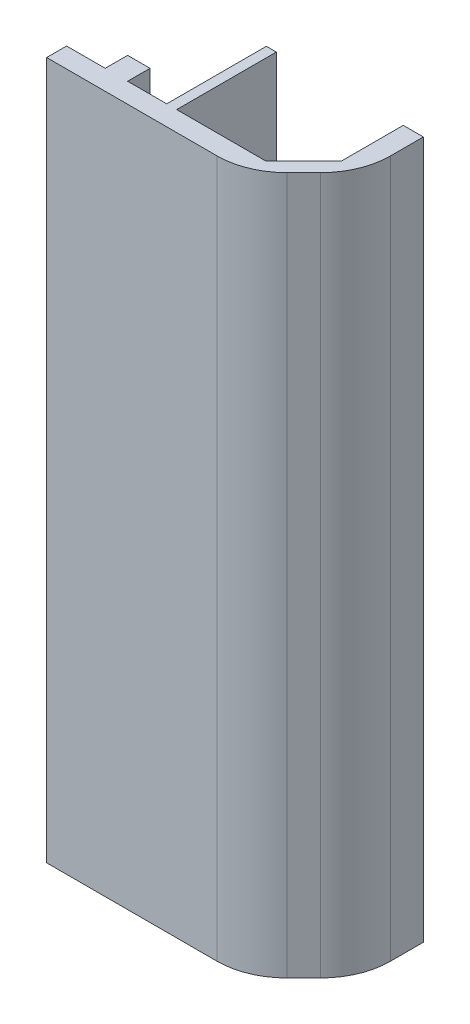
ISO-10303-21;
HEADER;
FILE_DESCRIPTION(('STEP AP214'),'2;1');
FILE_NAME('part.step','',(''),(''),'','','');
FILE_SCHEMA(('AUTOMOTIVE_DESIGN { 1 0 10303 214 1 1 1 1 }'));
ENDSEC;
DATA;
#1=APPLICATION_CONTEXT('core data for automotive mechanical design processes');
#2=APPLICATION_PROTOCOL_DEFINITION('international standard','automotive_design',2000,#1);
#3=PRODUCT_CONTEXT('',#1,'mechanical');
#4=PRODUCT('Part','Part','',(#3));
#5=PRODUCT_RELATED_PRODUCT_CATEGORY('part','',(#4));
#6=PRODUCT_DEFINITION_FORMATION('','',#4);
#7=PRODUCT_DEFINITION_CONTEXT('part definition',#1,'design');
#8=PRODUCT_DEFINITION('design','',#6,#7);
#9=PRODUCT_DEFINITION_SHAPE('','',#8);
#10=(LENGTH_UNIT() NAMED_UNIT(*) SI_UNIT(.MILLI.,.METRE.));
#11=(NAMED_UNIT(*) PLANE_ANGLE_UNIT() SI_UNIT($,.RADIAN.));
#12=(NAMED_UNIT(*) SI_UNIT($,.STERADIAN.) SOLID_ANGLE_UNIT());
#13=UNCERTAINTY_MEASURE_WITH_UNIT(LENGTH_MEASURE(1.E-05),#10,'distance_accuracy_value','');
#14=(GEOMETRIC_REPRESENTATION_CONTEXT(3) GLOBAL_UNCERTAINTY_ASSIGNED_CONTEXT((#13)) GLOBAL_UNIT_ASSIGNED_CONTEXT((#10,
#11,#12)) REPRESENTATION_CONTEXT('',''));
#15=CARTESIAN_POINT('',(0.,0.,0.));
#16=DIRECTION('',(0.,0.,1.));
#17=DIRECTION('',(1.,0.,0.));
#18=AXIS2_PLACEMENT_3D('',#15,#16,#17);
#19=CARTESIAN_POINT('',(-23.0017231924407,140.,-2.35925925925926));
#20=DIRECTION('',(0.,0.,1.));
#21=DIRECTION('',(1.,0.,0.));
#22=AXIS2_PLACEMENT_3D('',#19,#20,#21);
#23=PLANE('',#22);
#24=DIRECTION('',(0.,-1.,0.));
#25=VECTOR('',#24,1.);
#26=CARTESIAN_POINT('',(-13.1517231924407,140.,-2.35925925925926));
#27=LINE('',#26,#25);
#28=CARTESIAN_POINT('',(-13.1517231924407,140.,-2.35925925925926));
#29=VERTEX_POINT('',#28);
#30=CARTESIAN_POINT('',(-13.1517231924407,0.,-2.35925925925926));
#31=VERTEX_POINT('',#30);
#32=EDGE_CURVE('E59',#29,#31,#27,.T.);
#33=ORIENTED_EDGE('',*,*,#32,.F.);
#34=DIRECTION('',(-1.,0.,0.));
#35=VECTOR('',#34,1.);
#36=CARTESIAN_POINT('',(-23.0017231924407,140.,-2.35925925925926));
#37=LINE('',#36,#35);
#38=CARTESIAN_POINT('',(4.74827680755932,140.,-2.35925925925926));
#39=VERTEX_POINT('',#38);
#40=EDGE_CURVE('E218',#39,#29,#37,.T.);
#41=ORIENTED_EDGE('',*,*,#40,.F.);
#42=DIRECTION('',(0.,-1.,0.));
#43=VECTOR('',#42,1.);
#44=CARTESIAN_POINT('',(4.74827680755932,140.,-2.35925925925926));
#45=LINE('',#44,#43);
#46=CARTESIAN_POINT('',(4.74827680755932,0.,-2.35925925925926));
#47=VERTEX_POINT('',#46);
#48=EDGE_CURVE('E256',#39,#47,#45,.T.);
#49=ORIENTED_EDGE('',*,*,#48,.T.);
#50=DIRECTION('',(-1.,0.,0.));
#51=VECTOR('',#50,1.);
#52=CARTESIAN_POINT('',(-23.0017231924407,0.,-2.35925925925926));
#53=LINE('',#52,#51);
#54=EDGE_CURVE('E243',#47,#31,#53,.T.);
#55=ORIENTED_EDGE('',*,*,#54,.T.);
#56=EDGE_LOOP('',(#33,#41,#49,#55));
#57=FACE_BOUND('',#56,.T.);
#58=ADVANCED_FACE('F36',(#57),#23,.F.);
#59=DIRECTION('',(0.,1.,0.));
#60=VECTOR('',#59,1.);
#61=CARTESIAN_POINT('',(-15.1517231924407,140.,-2.35925925925926));
#62=LINE('',#61,#60);
#63=CARTESIAN_POINT('',(-15.1517231924407,0.,-2.35925925925926));
#64=VERTEX_POINT('',#63);
#65=CARTESIAN_POINT('',(-15.1517231924407,140.,-2.35925925925926));
#66=VERTEX_POINT('',#65);
#67=EDGE_CURVE('E184',#64,#66,#62,.T.);
#68=ORIENTED_EDGE('',*,*,#67,.F.);
#69=CARTESIAN_POINT('',(-23.0017231924407,0.,-2.35925925925926));
#70=VERTEX_POINT('',#69);
#71=EDGE_CURVE('E242',#64,#70,#53,.T.);
#72=ORIENTED_EDGE('',*,*,#71,.T.);
#73=DIRECTION('',(0.,-1.,0.));
#74=VECTOR('',#73,1.);
#75=CARTESIAN_POINT('',(-23.0017231924407,140.,-2.35925925925926));
#76=LINE('',#75,#74);
#77=CARTESIAN_POINT('',(-23.0017231924407,140.,-2.35925925925926));
#78=VERTEX_POINT('',#77);
#79=EDGE_CURVE('E253',#78,#70,#76,.T.);
#80=ORIENTED_EDGE('',*,*,#79,.F.);
#81=EDGE_CURVE('E51',#66,#78,#37,.T.);
#82=ORIENTED_EDGE('',*,*,#81,.F.);
#83=EDGE_LOOP('',(#68,#72,#80,#82));
#84=FACE_BOUND('',#83,.T.);
#85=ADVANCED_FACE('F328',(#84),#23,.F.);
#86=CARTESIAN_POINT('',(-27.5017231924407,140.,-6.85925925925926));
#87=DIRECTION('',(1.,0.,0.));
#88=DIRECTION('',(0.,0.,-1.));
#89=AXIS2_PLACEMENT_3D('',#86,#87,#88);
#90=PLANE('',#89);
#91=DIRECTION('',(0.,0.,1.));
#92=VECTOR('',#91,1.);
#93=CARTESIAN_POINT('',(-27.5017231924407,0.,-6.85925925925926));
#94=LINE('',#93,#92);
#95=CARTESIAN_POINT('',(-27.5017231924407,0.,-6.85925925925926));
#96=VERTEX_POINT('',#95);
#97=CARTESIAN_POINT('',(-27.5017231924407,0.,-2.35925925925926));
#98=VERTEX_POINT('',#97);
#99=EDGE_CURVE('E187',#96,#98,#94,.T.);
#100=ORIENTED_EDGE('',*,*,#99,.T.);
#101=DIRECTION('',(0.,-1.,0.));
#102=VECTOR('',#101,1.);
#103=CARTESIAN_POINT('',(-27.5017231924407,140.,-2.35925925925926));
#104=LINE('',#103,#102);
#105=CARTESIAN_POINT('',(-27.5017231924407,140.,-2.35925925925926));
#106=VERTEX_POINT('',#105);
#107=EDGE_CURVE('E274',#106,#98,#104,.T.);
#108=ORIENTED_EDGE('',*,*,#107,.F.);
#109=DIRECTION('',(0.,0.,1.));
#110=VECTOR('',#109,1.);
#111=CARTESIAN_POINT('',(-27.5017231924407,140.,-6.85925925925926));
#112=LINE('',#111,#110);
#113=CARTESIAN_POINT('',(-27.5017231924407,140.,-6.85925925925926));
#114=VERTEX_POINT('',#113);
#115=EDGE_CURVE('E196',#114,#106,#112,.T.);
#116=ORIENTED_EDGE('',*,*,#115,.F.);
#117=DIRECTION('',(0.,-1.,0.));
#118=VECTOR('',#117,1.);
#119=CARTESIAN_POINT('',(-27.5017231924407,140.,-6.85925925925926));
#120=LINE('',#119,#118);
#121=EDGE_CURVE('E223',#114,#96,#120,.T.);
#122=ORIENTED_EDGE('',*,*,#121,.T.);
#123=EDGE_LOOP('',(#100,#108,#116,#122));
#124=FACE_BOUND('',#123,.T.);
#125=ADVANCED_FACE('F318',(#124),#90,.F.);
#126=CARTESIAN_POINT('',(-27.5017231924407,140.,-2.35925925925926));
#127=DIRECTION('',(0.,0.,1.));
#128=DIRECTION('',(1.,0.,0.));
#129=AXIS2_PLACEMENT_3D('',#126,#127,#128);
#130=PLANE('',#129);
#131=DIRECTION('',(-1.,0.,0.));
#132=VECTOR('',#131,1.);
#133=CARTESIAN_POINT('',(-27.5017231924407,0.,-2.35925925925926));
#134=LINE('',#133,#132);
#135=CARTESIAN_POINT('',(-35.2517231924407,0.,-2.35925925925926));
#136=VERTEX_POINT('',#135);
#137=EDGE_CURVE('E190',#98,#136,#134,.T.);
#138=ORIENTED_EDGE('',*,*,#137,.T.);
#139=DIRECTION('',(0.,-1.,0.));
#140=VECTOR('',#139,1.);
#141=CARTESIAN_POINT('',(-35.2517231924407,140.,-2.35925925925926));
#142=LINE('',#141,#140);
#143=CARTESIAN_POINT('',(-35.2517231924407,140.,-2.35925925925926));
#144=VERTEX_POINT('',#143);
#145=EDGE_CURVE('E271',#144,#136,#142,.T.);
#146=ORIENTED_EDGE('',*,*,#145,.F.);
#147=DIRECTION('',(-1.,0.,0.));
#148=VECTOR('',#147,1.);
#149=CARTESIAN_POINT('',(-27.5017231924407,140.,-2.35925925925926));
#150=LINE('',#149,#148);
#151=EDGE_CURVE('E199',#106,#144,#150,.T.);
#152=ORIENTED_EDGE('',*,*,#151,.F.);
#153=ORIENTED_EDGE('',*,*,#107,.T.);
#154=EDGE_LOOP('',(#138,#146,#152,#153));
#155=FACE_BOUND('',#154,.T.);
#156=ADVANCED_FACE('F315',(#155),#130,.F.);
#157=CARTESIAN_POINT('',(-35.2517231924407,140.,-2.35925925925926));
#158=DIRECTION('',(1.,0.,0.));
#159=DIRECTION('',(0.,0.,-1.));
#160=AXIS2_PLACEMENT_3D('',#157,#158,#159);
#161=PLANE('',#160);
#162=DIRECTION('',(0.,0.,1.));
#163=VECTOR('',#162,1.);
#164=CARTESIAN_POINT('',(-35.2517231924407,0.,-2.35925925925926));
#165=LINE('',#164,#163);
#166=CARTESIAN_POINT('',(-35.2517231924407,0.,1.64074074074074));
#167=VERTEX_POINT('',#166);
#168=EDGE_CURVE('E226',#136,#167,#165,.T.);
#169=ORIENTED_EDGE('',*,*,#168,.T.);
#170=DIRECTION('',(0.,-1.,0.));
#171=VECTOR('',#170,1.);
#172=CARTESIAN_POINT('',(-35.2517231924407,140.,1.64074074074074));
#173=LINE('',#172,#171);
#174=CARTESIAN_POINT('',(-35.2517231924407,140.,1.64074074074074));
#175=VERTEX_POINT('',#174);
#176=EDGE_CURVE('E268',#175,#167,#173,.T.);
#177=ORIENTED_EDGE('',*,*,#176,.F.);
#178=DIRECTION('',(0.,0.,1.));
#179=VECTOR('',#178,1.);
#180=CARTESIAN_POINT('',(-35.2517231924407,140.,-2.35925925925926));
#181=LINE('',#180,#179);
#182=EDGE_CURVE('E202',#144,#175,#181,.T.);
#183=ORIENTED_EDGE('',*,*,#182,.F.);
#184=ORIENTED_EDGE('',*,*,#145,.T.);
#185=EDGE_LOOP('',(#169,#177,#183,#184));
#186=FACE_BOUND('',#185,.T.);
#187=ADVANCED_FACE('F309',(#186),#161,.F.);
#188=CARTESIAN_POINT('',(-35.2517231924407,140.,1.64074074074074));
#189=DIRECTION('',(0.,0.,-1.));
#190=DIRECTION('',(-1.,0.,0.));
#191=AXIS2_PLACEMENT_3D('',#188,#189,#190);
#192=PLANE('',#191);
#193=DIRECTION('',(1.,0.,0.));
#194=VECTOR('',#193,1.);
#195=CARTESIAN_POINT('',(-35.2517231924407,0.,1.64074074074074));
#196=LINE('',#195,#194);
#197=CARTESIAN_POINT('',(-1.02071306566402,0.,1.64074074074074));
#198=VERTEX_POINT('',#197);
#199=EDGE_CURVE('E228',#167,#198,#196,.T.);
#200=ORIENTED_EDGE('',*,*,#199,.T.);
#201=DIRECTION('',(0.,-1.,0.));
#202=VECTOR('',#201,1.);
#203=CARTESIAN_POINT('',(-1.02071306566402,140.,1.64074074074074));
#204=LINE('',#203,#202);
#205=CARTESIAN_POINT('',(-1.02071306566402,140.,1.64074074074074));
#206=VERTEX_POINT('',#205);
#207=EDGE_CURVE('E286',#198,#206,#204,.F.);
#208=ORIENTED_EDGE('',*,*,#207,.T.);
#209=DIRECTION('',(1.,0.,0.));
#210=VECTOR('',#209,1.);
#211=CARTESIAN_POINT('',(-35.2517231924407,140.,1.64074074074074));
#212=LINE('',#211,#210);
#213=EDGE_CURVE('E204',#175,#206,#212,.T.);
#214=ORIENTED_EDGE('',*,*,#213,.F.);
#215=ORIENTED_EDGE('',*,*,#176,.T.);
#216=EDGE_LOOP('',(#200,#208,#214,#215));
#217=FACE_BOUND('',#216,.T.);
#218=ADVANCED_FACE('F305',(#217),#192,.F.);
#219=CARTESIAN_POINT('',(4.77827680755932,140.,1.64074074074074));
#220=DIRECTION('',(-0.707106781186547,0.,-0.707106781186548));
#221=DIRECTION('',(-0.707106781186548,0.,0.707106781186547));
#222=AXIS2_PLACEMENT_3D('',#219,#220,#221);
#223=PLANE('',#222);
#224=DIRECTION('',(0.707106781186548,0.,-0.707106781186547));
#225=VECTOR('',#224,1.);
#226=CARTESIAN_POINT('',(4.77827680755932,140.,1.64074074074074));
#227=LINE('',#226,#225);
#228=CARTESIAN_POINT('',(8.87878187094765,140.,-2.45976432264759));
#229=VERTEX_POINT('',#228);
#230=CARTESIAN_POINT('',(12.2611050775043,140.,-5.84208752920423));
#231=VERTEX_POINT('',#230);
#232=EDGE_CURVE('E207',#229,#231,#227,.T.);
#233=ORIENTED_EDGE('',*,*,#232,.F.);
#234=DIRECTION('',(0.,-1.,0.));
#235=VECTOR('',#234,1.);
#236=CARTESIAN_POINT('',(8.87878187094765,140.,-2.45976432264759));
#237=LINE('',#236,#235);
#238=CARTESIAN_POINT('',(8.87878187094765,0.,-2.45976432264759));
#239=VERTEX_POINT('',#238);
#240=EDGE_CURVE('E279',#229,#239,#237,.T.);
#241=ORIENTED_EDGE('',*,*,#240,.T.);
#242=DIRECTION('',(0.707106781186548,0.,-0.707106781186547));
#243=VECTOR('',#242,1.);
#244=CARTESIAN_POINT('',(4.77827680755932,0.,1.64074074074074));
#245=LINE('',#244,#243);
#246=CARTESIAN_POINT('',(12.2611050775043,0.,-5.84208752920423));
#247=VERTEX_POINT('',#246);
#248=EDGE_CURVE('E231',#239,#247,#245,.T.);
#249=ORIENTED_EDGE('',*,*,#248,.T.);
#250=DIRECTION('',(0.,-1.,0.));
#251=VECTOR('',#250,1.);
#252=CARTESIAN_POINT('',(12.2611050775043,140.,-5.84208752920422));
#253=LINE('',#252,#251);
#254=EDGE_CURVE('E277',#247,#231,#253,.F.);
#255=ORIENTED_EDGE('',*,*,#254,.T.);
#256=EDGE_LOOP('',(#233,#241,#249,#255));
#257=FACE_BOUND('',#256,.T.);
#258=ADVANCED_FACE('F299',(#257),#223,.F.);
#259=CARTESIAN_POINT('',(16.3616101408926,140.,-22.3592592592593));
#260=DIRECTION('',(-1.,0.,0.));
#261=DIRECTION('',(0.,0.,1.));
#262=AXIS2_PLACEMENT_3D('',#259,#260,#261);
#263=PLANE('',#262);
#264=DIRECTION('',(0.,0.,-1.));
#265=VECTOR('',#264,1.);
#266=CARTESIAN_POINT('',(16.3616101408926,140.,-22.3592592592593));
#267=LINE('',#266,#265);
#268=CARTESIAN_POINT('',(16.3616101408926,140.,-15.7415824658159));
#269=VERTEX_POINT('',#268);
#270=CARTESIAN_POINT('',(16.3616101408926,140.,-22.3592592592593));
#271=VERTEX_POINT('',#270);
#272=EDGE_CURVE('E210',#269,#271,#267,.T.);
#273=ORIENTED_EDGE('',*,*,#272,.F.);
#274=DIRECTION('',(0.,-1.,0.));
#275=VECTOR('',#274,1.);
#276=CARTESIAN_POINT('',(16.3616101408926,140.,-15.7415824658159));
#277=LINE('',#276,#275);
#278=CARTESIAN_POINT('',(16.3616101408926,0.,-15.7415824658159));
#279=VERTEX_POINT('',#278);
#280=EDGE_CURVE('E11',#269,#279,#277,.T.);
#281=ORIENTED_EDGE('',*,*,#280,.T.);
#282=DIRECTION('',(0.,0.,-1.));
#283=VECTOR('',#282,1.);
#284=CARTESIAN_POINT('',(16.3616101408926,0.,-22.3592592592593));
#285=LINE('',#284,#283);
#286=CARTESIAN_POINT('',(16.3616101408926,0.,-22.3592592592593));
#287=VERTEX_POINT('',#286);
#288=EDGE_CURVE('E234',#279,#287,#285,.T.);
#289=ORIENTED_EDGE('',*,*,#288,.T.);
#290=DIRECTION('',(0.,-1.,0.));
#291=VECTOR('',#290,1.);
#292=CARTESIAN_POINT('',(16.3616101408926,140.,-22.3592592592593));
#293=LINE('',#292,#291);
#294=EDGE_CURVE('E265',#271,#287,#293,.T.);
#295=ORIENTED_EDGE('',*,*,#294,.F.);
#296=EDGE_LOOP('',(#273,#281,#289,#295));
#297=FACE_BOUND('',#296,.T.);
#298=ADVANCED_FACE('F358',(#297),#263,.F.);
#299=CARTESIAN_POINT('',(12.3316101408926,140.,-22.3592592592593));
#300=DIRECTION('',(0.,0.,1.));
#301=DIRECTION('',(1.,0.,0.));
#302=AXIS2_PLACEMENT_3D('',#299,#300,#301);
#303=PLANE('',#302);
#304=DIRECTION('',(-1.,0.,0.));
#305=VECTOR('',#304,1.);
#306=CARTESIAN_POINT('',(12.3316101408926,0.,-22.3592592592593));
#307=LINE('',#306,#305);
#308=CARTESIAN_POINT('',(12.3316101408926,0.,-22.3592592592593));
#309=VERTEX_POINT('',#308);
#310=EDGE_CURVE('E236',#287,#309,#307,.T.);
#311=ORIENTED_EDGE('',*,*,#310,.T.);
#312=DIRECTION('',(0.,-1.,0.));
#313=VECTOR('',#312,1.);
#314=CARTESIAN_POINT('',(12.3316101408926,140.,-22.3592592592593));
#315=LINE('',#314,#313);
#316=CARTESIAN_POINT('',(12.3316101408926,140.,-22.3592592592593));
#317=VERTEX_POINT('',#316);
#318=EDGE_CURVE('E262',#317,#309,#315,.T.);
#319=ORIENTED_EDGE('',*,*,#318,.F.);
#320=DIRECTION('',(-1.,0.,0.));
#321=VECTOR('',#320,1.);
#322=CARTESIAN_POINT('',(12.3316101408926,140.,-22.3592592592593));
#323=LINE('',#322,#321);
#324=EDGE_CURVE('E212',#271,#317,#323,.T.);
#325=ORIENTED_EDGE('',*,*,#324,.F.);
#326=ORIENTED_EDGE('',*,*,#294,.T.);
#327=EDGE_LOOP('',(#311,#319,#325,#326));
#328=FACE_BOUND('',#327,.T.);
#329=ADVANCED_FACE('F353',(#328),#303,.F.);
#330=CARTESIAN_POINT('',(12.3316101408926,140.,-9.94259259259255));
#331=DIRECTION('',(1.,0.,0.));
#332=DIRECTION('',(0.,0.,-1.));
#333=AXIS2_PLACEMENT_3D('',#330,#331,#332);
#334=PLANE('',#333);
#335=DIRECTION('',(0.,0.,1.));
#336=VECTOR('',#335,1.);
#337=CARTESIAN_POINT('',(12.3316101408926,0.,-9.94259259259255));
#338=LINE('',#337,#336);
#339=CARTESIAN_POINT('',(12.3316101408926,0.,-9.94259259259255));
#340=VERTEX_POINT('',#339);
#341=EDGE_CURVE('E238',#309,#340,#338,.T.);
#342=ORIENTED_EDGE('',*,*,#341,.T.);
#343=DIRECTION('',(0.,-1.,0.));
#344=VECTOR('',#343,1.);
#345=CARTESIAN_POINT('',(12.3316101408926,140.,-9.94259259259255));
#346=LINE('',#345,#344);
#347=CARTESIAN_POINT('',(12.3316101408926,140.,-9.94259259259255));
#348=VERTEX_POINT('',#347);
#349=EDGE_CURVE('E259',#348,#340,#346,.T.);
#350=ORIENTED_EDGE('',*,*,#349,.F.);
#351=DIRECTION('',(0.,0.,1.));
#352=VECTOR('',#351,1.);
#353=CARTESIAN_POINT('',(12.3316101408926,140.,-9.94259259259255));
#354=LINE('',#353,#352);
#355=EDGE_CURVE('E214',#317,#348,#354,.T.);
#356=ORIENTED_EDGE('',*,*,#355,.F.);
#357=ORIENTED_EDGE('',*,*,#318,.T.);
#358=EDGE_LOOP('',(#342,#350,#356,#357));
#359=FACE_BOUND('',#358,.T.);
#360=ADVANCED_FACE('F349',(#359),#334,.F.);
#361=CARTESIAN_POINT('',(4.74827680755932,140.,-2.35925925925926));
#362=DIRECTION('',(0.707106781186548,0.,0.707106781186548));
#363=DIRECTION('',(0.707106781186547,0.,-0.707106781186548));
#364=AXIS2_PLACEMENT_3D('',#361,#362,#363);
#365=PLANE('',#364);
#366=DIRECTION('',(-0.707106781186547,0.,0.707106781186548));
#367=VECTOR('',#366,1.);
#368=CARTESIAN_POINT('',(4.74827680755932,0.,-2.35925925925926));
#369=LINE('',#368,#367);
#370=EDGE_CURVE('E240',#340,#47,#369,.T.);
#371=ORIENTED_EDGE('',*,*,#370,.T.);
#372=ORIENTED_EDGE('',*,*,#48,.F.);
#373=DIRECTION('',(-0.707106781186547,0.,0.707106781186548));
#374=VECTOR('',#373,1.);
#375=CARTESIAN_POINT('',(4.74827680755932,140.,-2.35925925925926));
#376=LINE('',#375,#374);
#377=EDGE_CURVE('E216',#348,#39,#376,.T.);
#378=ORIENTED_EDGE('',*,*,#377,.F.);
#379=ORIENTED_EDGE('',*,*,#349,.T.);
#380=EDGE_LOOP('',(#371,#372,#378,#379));
#381=FACE_BOUND('',#380,.T.);
#382=ADVANCED_FACE('F345',(#381),#365,.F.);
#383=CARTESIAN_POINT('',(-23.0017231924407,140.,-6.85925925925926));
#384=DIRECTION('',(-1.,0.,0.));
#385=DIRECTION('',(0.,0.,1.));
#386=AXIS2_PLACEMENT_3D('',#383,#384,#385);
#387=PLANE('',#386);
#388=DIRECTION('',(0.,0.,-1.));
#389=VECTOR('',#388,1.);
#390=CARTESIAN_POINT('',(-23.0017231924407,0.,-6.85925925925926));
#391=LINE('',#390,#389);
#392=CARTESIAN_POINT('',(-23.0017231924407,0.,-6.85925925925926));
#393=VERTEX_POINT('',#392);
#394=EDGE_CURVE('E245',#70,#393,#391,.T.);
#395=ORIENTED_EDGE('',*,*,#394,.T.);
#396=DIRECTION('',(0.,-1.,0.));
#397=VECTOR('',#396,1.);
#398=CARTESIAN_POINT('',(-23.0017231924407,140.,-6.85925925925926));
#399=LINE('',#398,#397);
#400=CARTESIAN_POINT('',(-23.0017231924407,140.,-6.85925925925926));
#401=VERTEX_POINT('',#400);
#402=EDGE_CURVE('E250',#401,#393,#399,.T.);
#403=ORIENTED_EDGE('',*,*,#402,.F.);
#404=DIRECTION('',(0.,0.,-1.));
#405=VECTOR('',#404,1.);
#406=CARTESIAN_POINT('',(-23.0017231924407,140.,-6.85925925925926));
#407=LINE('',#406,#405);
#408=EDGE_CURVE('E220',#78,#401,#407,.T.);
#409=ORIENTED_EDGE('',*,*,#408,.F.);
#410=ORIENTED_EDGE('',*,*,#79,.T.);
#411=EDGE_LOOP('',(#395,#403,#409,#410));
#412=FACE_BOUND('',#411,.T.);
#413=ADVANCED_FACE('F326',(#412),#387,.F.);
#414=CARTESIAN_POINT('',(-27.5017231924407,140.,-6.85925925925926));
#415=DIRECTION('',(0.,0.,1.));
#416=DIRECTION('',(1.,0.,0.));
#417=AXIS2_PLACEMENT_3D('',#414,#415,#416);
#418=PLANE('',#417);
#419=DIRECTION('',(-1.,0.,0.));
#420=VECTOR('',#419,1.);
#421=CARTESIAN_POINT('',(-27.5017231924407,0.,-6.85925925925926));
#422=LINE('',#421,#420);
#423=EDGE_CURVE('E200',#393,#96,#422,.T.);
#424=ORIENTED_EDGE('',*,*,#423,.T.);
#425=ORIENTED_EDGE('',*,*,#121,.F.);
#426=DIRECTION('',(-1.,0.,0.));
#427=VECTOR('',#426,1.);
#428=CARTESIAN_POINT('',(-27.5017231924407,140.,-6.85925925925926));
#429=LINE('',#428,#427);
#430=EDGE_CURVE('E222',#401,#114,#429,.T.);
#431=ORIENTED_EDGE('',*,*,#430,.F.);
#432=ORIENTED_EDGE('',*,*,#402,.T.);
#433=EDGE_LOOP('',(#424,#425,#431,#432));
#434=FACE_BOUND('',#433,.T.);
#435=ADVANCED_FACE('F322',(#434),#418,.F.);
#436=CARTESIAN_POINT('',(0.,140.,0.));
#437=DIRECTION('',(0.,-1.,0.));
#438=DIRECTION('',(0.,0.,-1.));
#439=AXIS2_PLACEMENT_3D('',#436,#437,#438);
#440=PLANE('',#439);
#441=ORIENTED_EDGE('',*,*,#213,.T.);
#442=CARTESIAN_POINT('',(-1.02071306566402,140.,-12.3592592592593));
#443=DIRECTION('',(0.,-1.,0.));
#444=DIRECTION('',(0.,0.,-1.));
#445=AXIS2_PLACEMENT_3D('',#442,#443,#444);
#446=CIRCLE('',#445,14.);
#447=EDGE_CURVE('E44',#206,#229,#446,.F.);
#448=ORIENTED_EDGE('',*,*,#447,.T.);
#449=ORIENTED_EDGE('',*,*,#232,.T.);
#450=CARTESIAN_POINT('',(2.36161014089262,140.,-15.7415824658159));
#451=DIRECTION('',(0.,-1.,0.));
#452=DIRECTION('',(0.,0.,-1.));
#453=AXIS2_PLACEMENT_3D('',#450,#451,#452);
#454=CIRCLE('',#453,14.);
#455=EDGE_CURVE('E288',#231,#269,#454,.F.);
#456=ORIENTED_EDGE('',*,*,#455,.T.);
#457=ORIENTED_EDGE('',*,*,#272,.T.);
#458=ORIENTED_EDGE('',*,*,#324,.T.);
#459=ORIENTED_EDGE('',*,*,#355,.T.);
#460=ORIENTED_EDGE('',*,*,#377,.T.);
#461=ORIENTED_EDGE('',*,*,#40,.T.);
#462=DIRECTION('',(0.,0.,1.));
#463=VECTOR('',#462,1.);
#464=CARTESIAN_POINT('',(-13.1517231924407,140.,-22.3592592592593));
#465=LINE('',#464,#463);
#466=CARTESIAN_POINT('',(-13.1517231924407,140.,-22.3592592592593));
#467=VERTEX_POINT('',#466);
#468=EDGE_CURVE('E335',#467,#29,#465,.T.);
#469=ORIENTED_EDGE('',*,*,#468,.F.);
#470=DIRECTION('',(1.,0.,0.));
#471=VECTOR('',#470,1.);
#472=CARTESIAN_POINT('',(-13.1517231924407,140.,-22.3592592592593));
#473=LINE('',#472,#471);
#474=CARTESIAN_POINT('',(-15.1517231924407,140.,-22.3592592592593));
#475=VERTEX_POINT('',#474);
#476=EDGE_CURVE('E180',#475,#467,#473,.T.);
#477=ORIENTED_EDGE('',*,*,#476,.F.);
#478=DIRECTION('',(0.,0.,1.));
#479=VECTOR('',#478,1.);
#480=CARTESIAN_POINT('',(-15.1517231924407,140.,-22.3592592592593));
#481=LINE('',#480,#479);
#482=EDGE_CURVE('E192',#475,#66,#481,.T.);
#483=ORIENTED_EDGE('',*,*,#482,.T.);
#484=ORIENTED_EDGE('',*,*,#81,.T.);
#485=ORIENTED_EDGE('',*,*,#408,.T.);
#486=ORIENTED_EDGE('',*,*,#430,.T.);
#487=ORIENTED_EDGE('',*,*,#115,.T.);
#488=ORIENTED_EDGE('',*,*,#151,.T.);
#489=ORIENTED_EDGE('',*,*,#182,.T.);
#490=EDGE_LOOP('',(#441,#448,#449,#456,#457,#458,#459,#460,#461,#469,#477,#483,#484,#485,#486,
#487,#488,#489));
#491=FACE_BOUND('',#490,.T.);
#492=ADVANCED_FACE('F292',(#491),#440,.F.);
#493=CARTESIAN_POINT('',(0.,0.,0.));
#494=DIRECTION('',(0.,-1.,0.));
#495=DIRECTION('',(0.,0.,-1.));
#496=AXIS2_PLACEMENT_3D('',#493,#494,#495);
#497=PLANE('',#496);
#498=ORIENTED_EDGE('',*,*,#248,.F.);
#499=CARTESIAN_POINT('',(-1.02071306566402,0.,-12.3592592592593));
#500=DIRECTION('',(0.,-1.,0.));
#501=DIRECTION('',(0.,0.,-1.));
#502=AXIS2_PLACEMENT_3D('',#499,#500,#501);
#503=CIRCLE('',#502,14.);
#504=EDGE_CURVE('E284',#239,#198,#503,.T.);
#505=ORIENTED_EDGE('',*,*,#504,.T.);
#506=ORIENTED_EDGE('',*,*,#199,.F.);
#507=ORIENTED_EDGE('',*,*,#168,.F.);
#508=ORIENTED_EDGE('',*,*,#137,.F.);
#509=ORIENTED_EDGE('',*,*,#99,.F.);
#510=ORIENTED_EDGE('',*,*,#423,.F.);
#511=ORIENTED_EDGE('',*,*,#394,.F.);
#512=ORIENTED_EDGE('',*,*,#71,.F.);
#513=DIRECTION('',(0.,0.,1.));
#514=VECTOR('',#513,1.);
#515=CARTESIAN_POINT('',(-15.1517231924407,0.,-22.3592592592593));
#516=LINE('',#515,#514);
#517=CARTESIAN_POINT('',(-15.1517231924407,0.,-22.3592592592593));
#518=VERTEX_POINT('',#517);
#519=EDGE_CURVE('E171',#518,#64,#516,.T.);
#520=ORIENTED_EDGE('',*,*,#519,.F.);
#521=DIRECTION('',(-1.,0.,0.));
#522=VECTOR('',#521,1.);
#523=CARTESIAN_POINT('',(-13.1517231924407,0.,-22.3592592592593));
#524=LINE('',#523,#522);
#525=CARTESIAN_POINT('',(-13.1517231924407,0.,-22.3592592592593));
#526=VERTEX_POINT('',#525);
#527=EDGE_CURVE('E163',#526,#518,#524,.T.);
#528=ORIENTED_EDGE('',*,*,#527,.F.);
#529=DIRECTION('',(0.,0.,1.));
#530=VECTOR('',#529,1.);
#531=CARTESIAN_POINT('',(-13.1517231924407,0.,-22.3592592592593));
#532=LINE('',#531,#530);
#533=EDGE_CURVE('E169',#526,#31,#532,.T.);
#534=ORIENTED_EDGE('',*,*,#533,.T.);
#535=ORIENTED_EDGE('',*,*,#54,.F.);
#536=ORIENTED_EDGE('',*,*,#370,.F.);
#537=ORIENTED_EDGE('',*,*,#341,.F.);
#538=ORIENTED_EDGE('',*,*,#310,.F.);
#539=ORIENTED_EDGE('',*,*,#288,.F.);
#540=CARTESIAN_POINT('',(2.36161014089262,0.,-15.7415824658159));
#541=DIRECTION('',(0.,-1.,0.));
#542=DIRECTION('',(0.,0.,-1.));
#543=AXIS2_PLACEMENT_3D('',#540,#541,#542);
#544=CIRCLE('',#543,14.);
#545=EDGE_CURVE('E282',#279,#247,#544,.T.);
#546=ORIENTED_EDGE('',*,*,#545,.T.);
#547=EDGE_LOOP('',(#498,#505,#506,#507,#508,#509,#510,#511,#512,#520,#528,#534,#535,#536,#537,
#538,#539,#546));
#548=FACE_BOUND('',#547,.T.);
#549=ADVANCED_FACE('F166',(#548),#497,.T.);
#550=CARTESIAN_POINT('',(-1.02071306566402,140.,-12.3592592592593));
#551=DIRECTION('',(0.,-1.,0.));
#552=DIRECTION('',(0.,0.,-1.));
#553=AXIS2_PLACEMENT_3D('',#550,#551,#552);
#554=CYLINDRICAL_SURFACE('',#553,14.);
#555=ORIENTED_EDGE('',*,*,#447,.F.);
#556=ORIENTED_EDGE('',*,*,#207,.F.);
#557=ORIENTED_EDGE('',*,*,#504,.F.);
#558=ORIENTED_EDGE('',*,*,#240,.F.);
#559=EDGE_LOOP('',(#555,#556,#557,#558));
#560=FACE_BOUND('',#559,.T.);
#561=ADVANCED_FACE('F301',(#560),#554,.T.);
#562=CARTESIAN_POINT('',(2.36161014089262,140.,-15.7415824658159));
#563=DIRECTION('',(0.,-1.,0.));
#564=DIRECTION('',(0.,0.,-1.));
#565=AXIS2_PLACEMENT_3D('',#562,#563,#564);
#566=CYLINDRICAL_SURFACE('',#565,14.);
#567=ORIENTED_EDGE('',*,*,#455,.F.);
#568=ORIENTED_EDGE('',*,*,#254,.F.);
#569=ORIENTED_EDGE('',*,*,#545,.F.);
#570=ORIENTED_EDGE('',*,*,#280,.F.);
#571=EDGE_LOOP('',(#567,#568,#569,#570));
#572=FACE_BOUND('',#571,.T.);
#573=ADVANCED_FACE('F38',(#572),#566,.T.);
#574=CARTESIAN_POINT('',(-13.1517231924407,140.,-22.3592592592593));
#575=DIRECTION('',(-1.,0.,0.));
#576=DIRECTION('',(0.,-1.,0.));
#577=AXIS2_PLACEMENT_3D('',#574,#575,#576);
#578=PLANE('',#577);
#579=ORIENTED_EDGE('',*,*,#32,.T.);
#580=ORIENTED_EDGE('',*,*,#533,.F.);
#581=DIRECTION('',(0.,-1.,0.));
#582=VECTOR('',#581,1.);
#583=CARTESIAN_POINT('',(-13.1517231924407,140.,-22.3592592592593));
#584=LINE('',#583,#582);
#585=EDGE_CURVE('E175',#467,#526,#584,.T.);
#586=ORIENTED_EDGE('',*,*,#585,.F.);
#587=ORIENTED_EDGE('',*,*,#468,.T.);
#588=EDGE_LOOP('',(#579,#580,#586,#587));
#589=FACE_BOUND('',#588,.T.);
#590=ADVANCED_FACE('F186',(#589),#578,.F.);
#591=CARTESIAN_POINT('',(-15.1517231924407,140.,-22.3592592592593));
#592=DIRECTION('',(1.,0.,0.));
#593=DIRECTION('',(0.,1.,0.));
#594=AXIS2_PLACEMENT_3D('',#591,#592,#593);
#595=PLANE('',#594);
#596=ORIENTED_EDGE('',*,*,#67,.T.);
#597=ORIENTED_EDGE('',*,*,#482,.F.);
#598=DIRECTION('',(0.,1.,0.));
#599=VECTOR('',#598,1.);
#600=CARTESIAN_POINT('',(-15.1517231924407,140.,-22.3592592592593));
#601=LINE('',#600,#599);
#602=EDGE_CURVE('E174',#518,#475,#601,.T.);
#603=ORIENTED_EDGE('',*,*,#602,.F.);
#604=ORIENTED_EDGE('',*,*,#519,.T.);
#605=EDGE_LOOP('',(#596,#597,#603,#604));
#606=FACE_BOUND('',#605,.T.);
#607=ADVANCED_FACE('F333',(#606),#595,.F.);
#608=CARTESIAN_POINT('',(0.,0.,-22.3592592592593));
#609=DIRECTION('',(0.,0.,-1.));
#610=DIRECTION('',(-1.,0.,0.));
#611=AXIS2_PLACEMENT_3D('',#608,#609,#610);
#612=PLANE('',#611);
#613=ORIENTED_EDGE('',*,*,#585,.T.);
#614=ORIENTED_EDGE('',*,*,#527,.T.);
#615=ORIENTED_EDGE('',*,*,#602,.T.);
#616=ORIENTED_EDGE('',*,*,#476,.T.);
#617=EDGE_LOOP('',(#613,#614,#615,#616));
#618=FACE_BOUND('',#617,.T.);
#619=ADVANCED_FACE('F178',(#618),#612,.T.);
#620=CLOSED_SHELL('',(#58,#85,#125,#156,#187,#218,#258,#298,#329,#360,#382,#413,#435,#492,#549,
#561,#573,#590,#607,#619));
#621=MANIFOLD_SOLID_BREP('B2',#620);
#622=ADVANCED_BREP_SHAPE_REPRESENTATION('',(#18,#621),#14);
#623=SHAPE_DEFINITION_REPRESENTATION(#9,#622);
ENDSEC;
END-ISO-10303-21;
